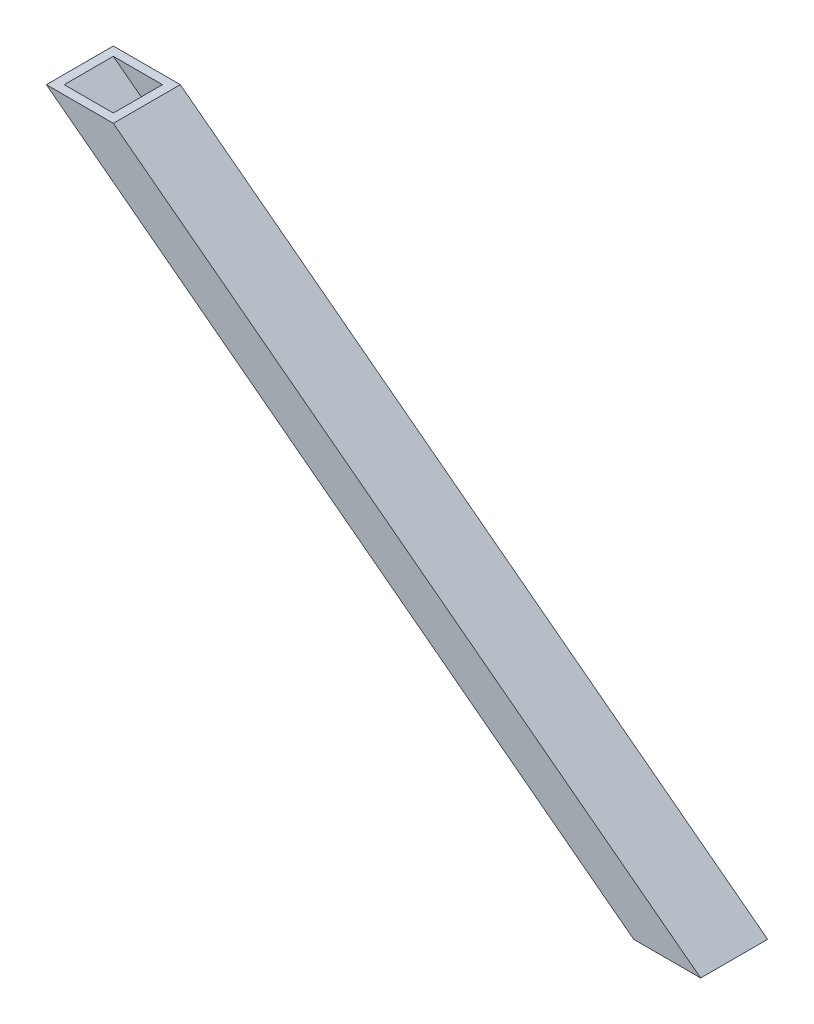
ISO-10303-21;
HEADER;
FILE_DESCRIPTION(('STEP AP214'),'2;1');
FILE_NAME('part.step','',(''),(''),'','','');
FILE_SCHEMA(('AUTOMOTIVE_DESIGN { 1 0 10303 214 1 1 1 1 }'));
ENDSEC;
DATA;
#1=APPLICATION_CONTEXT('core data for automotive mechanical design processes');
#2=APPLICATION_PROTOCOL_DEFINITION('international standard','automotive_design',2000,#1);
#3=PRODUCT_CONTEXT('',#1,'mechanical');
#4=PRODUCT('Part','Part','',(#3));
#5=PRODUCT_RELATED_PRODUCT_CATEGORY('part','',(#4));
#6=PRODUCT_DEFINITION_FORMATION('','',#4);
#7=PRODUCT_DEFINITION_CONTEXT('part definition',#1,'design');
#8=PRODUCT_DEFINITION('design','',#6,#7);
#9=PRODUCT_DEFINITION_SHAPE('','',#8);
#10=(LENGTH_UNIT() NAMED_UNIT(*) SI_UNIT(.MILLI.,.METRE.));
#11=(NAMED_UNIT(*) PLANE_ANGLE_UNIT() SI_UNIT($,.RADIAN.));
#12=(NAMED_UNIT(*) SI_UNIT($,.STERADIAN.) SOLID_ANGLE_UNIT());
#13=UNCERTAINTY_MEASURE_WITH_UNIT(LENGTH_MEASURE(1.E-05),#10,'distance_accuracy_value','');
#14=(GEOMETRIC_REPRESENTATION_CONTEXT(3) GLOBAL_UNCERTAINTY_ASSIGNED_CONTEXT((#13)) GLOBAL_UNIT_ASSIGNED_CONTEXT((#10,
#11,#12)) REPRESENTATION_CONTEXT('',''));
#15=CARTESIAN_POINT('',(0.,0.,0.));
#16=DIRECTION('',(0.,0.,1.));
#17=DIRECTION('',(1.,0.,0.));
#18=AXIS2_PLACEMENT_3D('',#15,#16,#17);
#19=CARTESIAN_POINT('',(620.234697348416,-499.999769928935,37.5000000000001));
#20=DIRECTION('',(0.,0.,1.));
#21=DIRECTION('',(1.,0.,0.));
#22=AXIS2_PLACEMENT_3D('',#19,#20,#21);
#23=PLANE('',#22);
#24=DIRECTION('',(1.,0.,0.));
#25=VECTOR('',#24,1.);
#26=CARTESIAN_POINT('',(-37.5,0.,37.5000000000001));
#27=LINE('',#26,#25);
#28=CARTESIAN_POINT('',(-37.5,0.,37.5000000000001));
#29=VERTEX_POINT('',#28);
#30=CARTESIAN_POINT('',(37.5,0.,37.5000000000001));
#31=VERTEX_POINT('',#30);
#32=EDGE_CURVE('E155',#29,#31,#27,.T.);
#33=ORIENTED_EDGE('',*,*,#32,.F.);
#34=DIRECTION('',(-0.796091402676595,0.605176402864828,0.));
#35=VECTOR('',#34,1.);
#36=CARTESIAN_POINT('',(620.234697348416,-499.999769928935,37.5000000000001));
#37=LINE('',#36,#35);
#38=CARTESIAN_POINT('',(620.234697348416,-499.999769928935,37.5000000000001));
#39=VERTEX_POINT('',#38);
#40=EDGE_CURVE('E12',#39,#29,#37,.T.);
#41=ORIENTED_EDGE('',*,*,#40,.F.);
#42=DIRECTION('',(1.,0.,0.));
#43=VECTOR('',#42,1.);
#44=CARTESIAN_POINT('',(620.234697348416,-499.999769928935,37.5000000000001));
#45=LINE('',#44,#43);
#46=CARTESIAN_POINT('',(695.234697348416,-499.999769928935,37.5000000000001));
#47=VERTEX_POINT('',#46);
#48=EDGE_CURVE('E159',#39,#47,#45,.T.);
#49=ORIENTED_EDGE('',*,*,#48,.T.);
#50=DIRECTION('',(-0.796091402676595,0.605176402864828,0.));
#51=VECTOR('',#50,1.);
#52=CARTESIAN_POINT('',(695.234697348416,-499.999769928935,37.5000000000001));
#53=LINE('',#52,#51);
#54=EDGE_CURVE('E61',#47,#31,#53,.T.);
#55=ORIENTED_EDGE('',*,*,#54,.T.);
#56=EDGE_LOOP('',(#33,#41,#49,#55));
#57=FACE_BOUND('',#56,.T.);
#58=ADVANCED_FACE('F58',(#57),#23,.T.);
#59=CARTESIAN_POINT('',(620.234697348416,-499.999769928935,-37.5000000000001));
#60=DIRECTION('',(-0.605176402864828,-0.796091402676595,0.));
#61=DIRECTION('',(0.796091402676595,-0.605176402864828,0.));
#62=AXIS2_PLACEMENT_3D('',#59,#60,#61);
#63=PLANE('',#62);
#64=DIRECTION('',(0.,0.,1.));
#65=VECTOR('',#64,1.);
#66=CARTESIAN_POINT('',(-37.5,0.,-37.5000000000001));
#67=LINE('',#66,#65);
#68=CARTESIAN_POINT('',(-37.5,0.,-37.5000000000001));
#69=VERTEX_POINT('',#68);
#70=EDGE_CURVE('E163',#69,#29,#67,.T.);
#71=ORIENTED_EDGE('',*,*,#70,.F.);
#72=DIRECTION('',(-0.796091402676595,0.605176402864828,0.));
#73=VECTOR('',#72,1.);
#74=CARTESIAN_POINT('',(620.234697348416,-499.999769928935,-37.5000000000001));
#75=LINE('',#74,#73);
#76=CARTESIAN_POINT('',(620.234697348416,-499.999769928935,-37.5000000000001));
#77=VERTEX_POINT('',#76);
#78=EDGE_CURVE('E66',#77,#69,#75,.T.);
#79=ORIENTED_EDGE('',*,*,#78,.F.);
#80=DIRECTION('',(0.,0.,1.));
#81=VECTOR('',#80,1.);
#82=CARTESIAN_POINT('',(620.234697348416,-499.999769928935,-37.5000000000001));
#83=LINE('',#82,#81);
#84=EDGE_CURVE('E167',#77,#39,#83,.T.);
#85=ORIENTED_EDGE('',*,*,#84,.T.);
#86=ORIENTED_EDGE('',*,*,#40,.T.);
#87=EDGE_LOOP('',(#71,#79,#85,#86));
#88=FACE_BOUND('',#87,.T.);
#89=ADVANCED_FACE('F195',(#88),#63,.T.);
#90=CARTESIAN_POINT('',(620.234697348416,-499.999769928935,-37.5000000000001));
#91=DIRECTION('',(0.,0.,1.));
#92=DIRECTION('',(1.,0.,0.));
#93=AXIS2_PLACEMENT_3D('',#90,#91,#92);
#94=PLANE('',#93);
#95=DIRECTION('',(1.,0.,0.));
#96=VECTOR('',#95,1.);
#97=CARTESIAN_POINT('',(-37.5,0.,-37.5000000000001));
#98=LINE('',#97,#96);
#99=CARTESIAN_POINT('',(37.5,0.,-37.5000000000001));
#100=VERTEX_POINT('',#99);
#101=EDGE_CURVE('E175',#69,#100,#98,.T.);
#102=ORIENTED_EDGE('',*,*,#101,.T.);
#103=DIRECTION('',(-0.796091402676595,0.605176402864828,0.));
#104=VECTOR('',#103,1.);
#105=CARTESIAN_POINT('',(695.234697348416,-499.999769928935,-37.5000000000001));
#106=LINE('',#105,#104);
#107=CARTESIAN_POINT('',(695.234697348416,-499.999769928935,-37.5000000000001));
#108=VERTEX_POINT('',#107);
#109=EDGE_CURVE('E179',#108,#100,#106,.T.);
#110=ORIENTED_EDGE('',*,*,#109,.F.);
#111=DIRECTION('',(1.,0.,0.));
#112=VECTOR('',#111,1.);
#113=CARTESIAN_POINT('',(620.234697348416,-499.999769928935,-37.5000000000001));
#114=LINE('',#113,#112);
#115=EDGE_CURVE('E165',#77,#108,#114,.T.);
#116=ORIENTED_EDGE('',*,*,#115,.F.);
#117=ORIENTED_EDGE('',*,*,#78,.T.);
#118=EDGE_LOOP('',(#102,#110,#116,#117));
#119=FACE_BOUND('',#118,.T.);
#120=ADVANCED_FACE('F199',(#119),#94,.F.);
#121=CARTESIAN_POINT('',(695.234697348416,-499.999769928935,-37.5000000000001));
#122=DIRECTION('',(-0.605176402864828,-0.796091402676595,0.));
#123=DIRECTION('',(0.796091402676595,-0.605176402864828,0.));
#124=AXIS2_PLACEMENT_3D('',#121,#122,#123);
#125=PLANE('',#124);
#126=DIRECTION('',(0.,0.,1.));
#127=VECTOR('',#126,1.);
#128=CARTESIAN_POINT('',(37.5,0.,-37.5000000000001));
#129=LINE('',#128,#127);
#130=EDGE_CURVE('E172',#100,#31,#129,.T.);
#131=ORIENTED_EDGE('',*,*,#130,.T.);
#132=ORIENTED_EDGE('',*,*,#54,.F.);
#133=DIRECTION('',(0.,0.,1.));
#134=VECTOR('',#133,1.);
#135=CARTESIAN_POINT('',(695.234697348416,-499.999769928935,-37.5000000000001));
#136=LINE('',#135,#134);
#137=EDGE_CURVE('E162',#108,#47,#136,.T.);
#138=ORIENTED_EDGE('',*,*,#137,.F.);
#139=ORIENTED_EDGE('',*,*,#109,.T.);
#140=EDGE_LOOP('',(#131,#132,#138,#139));
#141=FACE_BOUND('',#140,.T.);
#142=ADVANCED_FACE('F189',(#141),#125,.F.);
#143=CARTESIAN_POINT('',(657.734697348416,-499.999769928935,0.));
#144=DIRECTION('',(0.,-1.,0.));
#145=DIRECTION('',(0.,0.,-1.));
#146=AXIS2_PLACEMENT_3D('',#143,#144,#145);
#147=PLANE('',#146);
#148=DIRECTION('',(1.,0.,0.));
#149=VECTOR('',#148,1.);
#150=CARTESIAN_POINT('',(630.234697348416,-499.999769928935,27.5000000000001));
#151=LINE('',#150,#149);
#152=CARTESIAN_POINT('',(630.234697348416,-499.999769928935,27.5000000000001));
#153=VERTEX_POINT('',#152);
#154=CARTESIAN_POINT('',(685.234697348416,-499.999769928935,27.5000000000001));
#155=VERTEX_POINT('',#154);
#156=EDGE_CURVE('E130',#153,#155,#151,.T.);
#157=ORIENTED_EDGE('',*,*,#156,.T.);
#158=DIRECTION('',(0.,0.,1.));
#159=VECTOR('',#158,1.);
#160=CARTESIAN_POINT('',(685.234697348416,-499.999769928935,-27.5000000000001));
#161=LINE('',#160,#159);
#162=CARTESIAN_POINT('',(685.234697348416,-499.999769928935,-27.5000000000001));
#163=VERTEX_POINT('',#162);
#164=EDGE_CURVE('E122',#163,#155,#161,.T.);
#165=ORIENTED_EDGE('',*,*,#164,.F.);
#166=DIRECTION('',(1.,0.,0.));
#167=VECTOR('',#166,1.);
#168=CARTESIAN_POINT('',(630.234697348416,-499.999769928935,-27.5000000000001));
#169=LINE('',#168,#167);
#170=CARTESIAN_POINT('',(630.234697348416,-499.999769928935,-27.5000000000001));
#171=VERTEX_POINT('',#170);
#172=EDGE_CURVE('E129',#171,#163,#169,.T.);
#173=ORIENTED_EDGE('',*,*,#172,.F.);
#174=DIRECTION('',(0.,0.,1.));
#175=VECTOR('',#174,1.);
#176=CARTESIAN_POINT('',(630.234697348416,-499.999769928935,-27.5000000000001));
#177=LINE('',#176,#175);
#178=EDGE_CURVE('E135',#171,#153,#177,.T.);
#179=ORIENTED_EDGE('',*,*,#178,.T.);
#180=EDGE_LOOP('',(#157,#165,#173,#179));
#181=FACE_BOUND('',#180,.T.);
#182=ORIENTED_EDGE('',*,*,#48,.F.);
#183=ORIENTED_EDGE('',*,*,#84,.F.);
#184=ORIENTED_EDGE('',*,*,#115,.T.);
#185=ORIENTED_EDGE('',*,*,#137,.T.);
#186=EDGE_LOOP('',(#182,#183,#184,#185));
#187=FACE_BOUND('',#186,.T.);
#188=ADVANCED_FACE('F137',(#181,#187),#147,.T.);
#189=CARTESIAN_POINT('',(0.,0.,0.));
#190=DIRECTION('',(0.,-1.,0.));
#191=DIRECTION('',(0.,0.,-1.));
#192=AXIS2_PLACEMENT_3D('',#189,#190,#191);
#193=PLANE('',#192);
#194=DIRECTION('',(0.,0.,1.));
#195=VECTOR('',#194,1.);
#196=CARTESIAN_POINT('',(27.5,0.,-27.5000000000001));
#197=LINE('',#196,#195);
#198=CARTESIAN_POINT('',(27.5,0.,-27.5000000000001));
#199=VERTEX_POINT('',#198);
#200=CARTESIAN_POINT('',(27.4999999999999,0.,27.5000000000001));
#201=VERTEX_POINT('',#200);
#202=EDGE_CURVE('E149',#199,#201,#197,.T.);
#203=ORIENTED_EDGE('',*,*,#202,.T.);
#204=DIRECTION('',(1.,0.,0.));
#205=VECTOR('',#204,1.);
#206=CARTESIAN_POINT('',(-27.5,0.,27.5000000000001));
#207=LINE('',#206,#205);
#208=CARTESIAN_POINT('',(-27.5,0.,27.5000000000001));
#209=VERTEX_POINT('',#208);
#210=EDGE_CURVE('E82',#209,#201,#207,.T.);
#211=ORIENTED_EDGE('',*,*,#210,.F.);
#212=DIRECTION('',(0.,0.,1.));
#213=VECTOR('',#212,1.);
#214=CARTESIAN_POINT('',(-27.5,0.,-27.5000000000001));
#215=LINE('',#214,#213);
#216=CARTESIAN_POINT('',(-27.5,0.,-27.5000000000001));
#217=VERTEX_POINT('',#216);
#218=EDGE_CURVE('E140',#217,#209,#215,.T.);
#219=ORIENTED_EDGE('',*,*,#218,.F.);
#220=DIRECTION('',(1.,0.,0.));
#221=VECTOR('',#220,1.);
#222=CARTESIAN_POINT('',(-27.5,0.,-27.5000000000001));
#223=LINE('',#222,#221);
#224=EDGE_CURVE('E143',#217,#199,#223,.T.);
#225=ORIENTED_EDGE('',*,*,#224,.T.);
#226=EDGE_LOOP('',(#203,#211,#219,#225));
#227=FACE_BOUND('',#226,.T.);
#228=ORIENTED_EDGE('',*,*,#32,.T.);
#229=ORIENTED_EDGE('',*,*,#130,.F.);
#230=ORIENTED_EDGE('',*,*,#101,.F.);
#231=ORIENTED_EDGE('',*,*,#70,.T.);
#232=EDGE_LOOP('',(#228,#229,#230,#231));
#233=FACE_BOUND('',#232,.T.);
#234=ADVANCED_FACE('F192',(#227,#233),#193,.F.);
#235=CARTESIAN_POINT('',(630.234697348416,-499.999769928935,27.5000000000001));
#236=DIRECTION('',(0.,0.,1.));
#237=DIRECTION('',(1.,0.,0.));
#238=AXIS2_PLACEMENT_3D('',#235,#236,#237);
#239=PLANE('',#238);
#240=ORIENTED_EDGE('',*,*,#210,.T.);
#241=DIRECTION('',(-0.796091402676595,0.605176402864828,0.));
#242=VECTOR('',#241,1.);
#243=CARTESIAN_POINT('',(685.234697348416,-499.999769928935,27.5000000000001));
#244=LINE('',#243,#242);
#245=EDGE_CURVE('E124',#155,#201,#244,.T.);
#246=ORIENTED_EDGE('',*,*,#245,.F.);
#247=ORIENTED_EDGE('',*,*,#156,.F.);
#248=DIRECTION('',(-0.796091402676595,0.605176402864828,0.));
#249=VECTOR('',#248,1.);
#250=CARTESIAN_POINT('',(630.234697348416,-499.999769928935,27.5000000000001));
#251=LINE('',#250,#249);
#252=EDGE_CURVE('E153',#153,#209,#251,.T.);
#253=ORIENTED_EDGE('',*,*,#252,.T.);
#254=EDGE_LOOP('',(#240,#246,#247,#253));
#255=FACE_BOUND('',#254,.T.);
#256=ADVANCED_FACE('F133',(#255),#239,.F.);
#257=CARTESIAN_POINT('',(630.234697348416,-499.999769928935,-27.5000000000001));
#258=DIRECTION('',(-0.605176402864828,-0.796091402676595,0.));
#259=DIRECTION('',(0.796091402676595,-0.605176402864828,0.));
#260=AXIS2_PLACEMENT_3D('',#257,#258,#259);
#261=PLANE('',#260);
#262=ORIENTED_EDGE('',*,*,#218,.T.);
#263=ORIENTED_EDGE('',*,*,#252,.F.);
#264=ORIENTED_EDGE('',*,*,#178,.F.);
#265=DIRECTION('',(-0.796091402676595,0.605176402864828,0.));
#266=VECTOR('',#265,1.);
#267=CARTESIAN_POINT('',(630.234697348416,-499.999769928935,-27.5000000000001));
#268=LINE('',#267,#266);
#269=EDGE_CURVE('E156',#171,#217,#268,.T.);
#270=ORIENTED_EDGE('',*,*,#269,.T.);
#271=EDGE_LOOP('',(#262,#263,#264,#270));
#272=FACE_BOUND('',#271,.T.);
#273=ADVANCED_FACE('F250',(#272),#261,.F.);
#274=CARTESIAN_POINT('',(630.234697348416,-499.999769928935,-27.5000000000001));
#275=DIRECTION('',(0.,0.,1.));
#276=DIRECTION('',(1.,0.,0.));
#277=AXIS2_PLACEMENT_3D('',#274,#275,#276);
#278=PLANE('',#277);
#279=ORIENTED_EDGE('',*,*,#224,.F.);
#280=ORIENTED_EDGE('',*,*,#269,.F.);
#281=ORIENTED_EDGE('',*,*,#172,.T.);
#282=DIRECTION('',(-0.796091402676595,0.605176402864828,0.));
#283=VECTOR('',#282,1.);
#284=CARTESIAN_POINT('',(685.234697348416,-499.999769928935,-27.5000000000001));
#285=LINE('',#284,#283);
#286=EDGE_CURVE('E74',#163,#199,#285,.T.);
#287=ORIENTED_EDGE('',*,*,#286,.T.);
#288=EDGE_LOOP('',(#279,#280,#281,#287));
#289=FACE_BOUND('',#288,.T.);
#290=ADVANCED_FACE('F259',(#289),#278,.T.);
#291=CARTESIAN_POINT('',(685.234697348416,-499.999769928935,-27.5000000000001));
#292=DIRECTION('',(-0.605176402864828,-0.796091402676595,0.));
#293=DIRECTION('',(0.796091402676595,-0.605176402864828,0.));
#294=AXIS2_PLACEMENT_3D('',#291,#292,#293);
#295=PLANE('',#294);
#296=ORIENTED_EDGE('',*,*,#202,.F.);
#297=ORIENTED_EDGE('',*,*,#286,.F.);
#298=ORIENTED_EDGE('',*,*,#164,.T.);
#299=ORIENTED_EDGE('',*,*,#245,.T.);
#300=EDGE_LOOP('',(#296,#297,#298,#299));
#301=FACE_BOUND('',#300,.T.);
#302=ADVANCED_FACE('F123',(#301),#295,.T.);
#303=CLOSED_SHELL('',(#58,#89,#120,#142,#188,#234,#256,#273,#290,#302));
#304=MANIFOLD_SOLID_BREP('B2',#303);
#305=ADVANCED_BREP_SHAPE_REPRESENTATION('',(#18,#304),#14);
#306=SHAPE_DEFINITION_REPRESENTATION(#9,#305);
ENDSEC;
END-ISO-10303-21;
